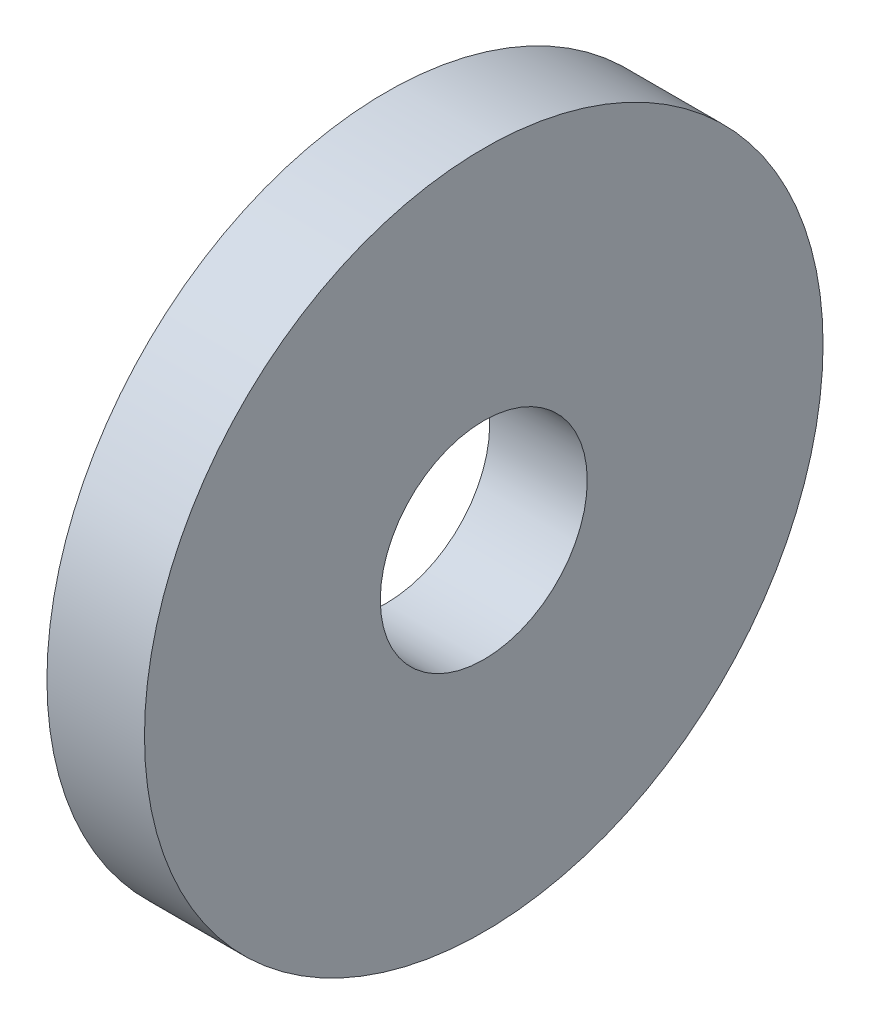
ISO-10303-21;
HEADER;
FILE_DESCRIPTION(('STEP AP214'),'2;1');
FILE_NAME('part.step','',(''),(''),'','','');
FILE_SCHEMA(('AUTOMOTIVE_DESIGN { 1 0 10303 214 1 1 1 1 }'));
ENDSEC;
DATA;
#1=APPLICATION_CONTEXT('core data for automotive mechanical design processes');
#2=APPLICATION_PROTOCOL_DEFINITION('international standard','automotive_design',2000,#1);
#3=PRODUCT_CONTEXT('',#1,'mechanical');
#4=PRODUCT('Part','Part','',(#3));
#5=PRODUCT_RELATED_PRODUCT_CATEGORY('part','',(#4));
#6=PRODUCT_DEFINITION_FORMATION('','',#4);
#7=PRODUCT_DEFINITION_CONTEXT('part definition',#1,'design');
#8=PRODUCT_DEFINITION('design','',#6,#7);
#9=PRODUCT_DEFINITION_SHAPE('','',#8);
#10=(LENGTH_UNIT() NAMED_UNIT(*) SI_UNIT(.MILLI.,.METRE.));
#11=(NAMED_UNIT(*) PLANE_ANGLE_UNIT() SI_UNIT($,.RADIAN.));
#12=(NAMED_UNIT(*) SI_UNIT($,.STERADIAN.) SOLID_ANGLE_UNIT());
#13=UNCERTAINTY_MEASURE_WITH_UNIT(LENGTH_MEASURE(1.E-05),#10,'distance_accuracy_value','');
#14=(GEOMETRIC_REPRESENTATION_CONTEXT(3) GLOBAL_UNCERTAINTY_ASSIGNED_CONTEXT((#13)) GLOBAL_UNIT_ASSIGNED_CONTEXT((#10,
#11,#12)) REPRESENTATION_CONTEXT('',''));
#15=CARTESIAN_POINT('',(0.,0.,0.));
#16=DIRECTION('',(0.,0.,1.));
#17=DIRECTION('',(1.,0.,0.));
#18=AXIS2_PLACEMENT_3D('',#15,#16,#17);
#19=CARTESIAN_POINT('',(-34.9249999999999,0.,0.));
#20=DIRECTION('',(-1.,0.,0.));
#21=DIRECTION('',(0.,0.,1.));
#22=AXIS2_PLACEMENT_3D('',#19,#20,#21);
#23=CYLINDRICAL_SURFACE('',#22,2.44);
#24=CARTESIAN_POINT('',(0.,0.,0.));
#25=DIRECTION('',(-1.,0.,0.));
#26=DIRECTION('',(0.,0.,1.));
#27=AXIS2_PLACEMENT_3D('',#24,#25,#26);
#28=CIRCLE('',#27,2.44);
#29=CARTESIAN_POINT('',(0.,0.,2.44));
#30=VERTEX_POINT('',#29);
#31=EDGE_CURVE('E10',#30,#30,#28,.T.);
#32=ORIENTED_EDGE('',*,*,#31,.F.);
#33=EDGE_LOOP('',(#32));
#34=FACE_BOUND('',#33,.T.);
#35=CARTESIAN_POINT('',(-2.3,0.,0.));
#36=DIRECTION('',(-1.,0.,0.));
#37=DIRECTION('',(0.,0.,1.));
#38=AXIS2_PLACEMENT_3D('',#35,#36,#37);
#39=CIRCLE('',#38,2.44);
#40=CARTESIAN_POINT('',(-2.3,0.,2.44));
#41=VERTEX_POINT('',#40);
#42=EDGE_CURVE('E49',#41,#41,#39,.T.);
#43=ORIENTED_EDGE('',*,*,#42,.T.);
#44=EDGE_LOOP('',(#43));
#45=FACE_BOUND('',#44,.T.);
#46=ADVANCED_FACE('F33',(#34,#45),#23,.F.);
#47=CARTESIAN_POINT('',(0.,2.44,0.));
#48=DIRECTION('',(-1.,0.,0.));
#49=DIRECTION('',(0.,0.,1.));
#50=AXIS2_PLACEMENT_3D('',#47,#48,#49);
#51=PLANE('',#50);
#52=CARTESIAN_POINT('',(0.,0.,0.));
#53=DIRECTION('',(-1.,0.,0.));
#54=DIRECTION('',(0.,0.,1.));
#55=AXIS2_PLACEMENT_3D('',#52,#53,#54);
#56=CIRCLE('',#55,8.);
#57=CARTESIAN_POINT('',(0.,0.,8.));
#58=VERTEX_POINT('',#57);
#59=EDGE_CURVE('E39',#58,#58,#56,.T.);
#60=ORIENTED_EDGE('',*,*,#59,.F.);
#61=EDGE_LOOP('',(#60));
#62=FACE_BOUND('',#61,.T.);
#63=ORIENTED_EDGE('',*,*,#31,.T.);
#64=EDGE_LOOP('',(#63));
#65=FACE_BOUND('',#64,.T.);
#66=ADVANCED_FACE('F64',(#62,#65),#51,.F.);
#67=CARTESIAN_POINT('',(-34.9249999999999,0.,0.));
#68=DIRECTION('',(-1.,0.,0.));
#69=DIRECTION('',(0.,0.,1.));
#70=AXIS2_PLACEMENT_3D('',#67,#68,#69);
#71=CYLINDRICAL_SURFACE('',#70,8.);
#72=CARTESIAN_POINT('',(-2.3,0.,0.));
#73=DIRECTION('',(-1.,0.,0.));
#74=DIRECTION('',(0.,0.,1.));
#75=AXIS2_PLACEMENT_3D('',#72,#73,#74);
#76=CIRCLE('',#75,8.);
#77=CARTESIAN_POINT('',(-2.3,0.,8.));
#78=VERTEX_POINT('',#77);
#79=EDGE_CURVE('E44',#78,#78,#76,.T.);
#80=ORIENTED_EDGE('',*,*,#79,.F.);
#81=EDGE_LOOP('',(#80));
#82=FACE_BOUND('',#81,.T.);
#83=ORIENTED_EDGE('',*,*,#59,.T.);
#84=EDGE_LOOP('',(#83));
#85=FACE_BOUND('',#84,.T.);
#86=ADVANCED_FACE('F59',(#82,#85),#71,.T.);
#87=CARTESIAN_POINT('',(-2.3,8.,0.));
#88=DIRECTION('',(1.,0.,0.));
#89=DIRECTION('',(0.,0.,-1.));
#90=AXIS2_PLACEMENT_3D('',#87,#88,#89);
#91=PLANE('',#90);
#92=ORIENTED_EDGE('',*,*,#42,.F.);
#93=EDGE_LOOP('',(#92));
#94=FACE_BOUND('',#93,.T.);
#95=ORIENTED_EDGE('',*,*,#79,.T.);
#96=EDGE_LOOP('',(#95));
#97=FACE_BOUND('',#96,.T.);
#98=ADVANCED_FACE('F56',(#94,#97),#91,.F.);
#99=CLOSED_SHELL('',(#46,#66,#86,#98));
#100=MANIFOLD_SOLID_BREP('B2',#99);
#101=ADVANCED_BREP_SHAPE_REPRESENTATION('',(#18,#100),#14);
#102=SHAPE_DEFINITION_REPRESENTATION(#9,#101);
ENDSEC;
END-ISO-10303-21;
